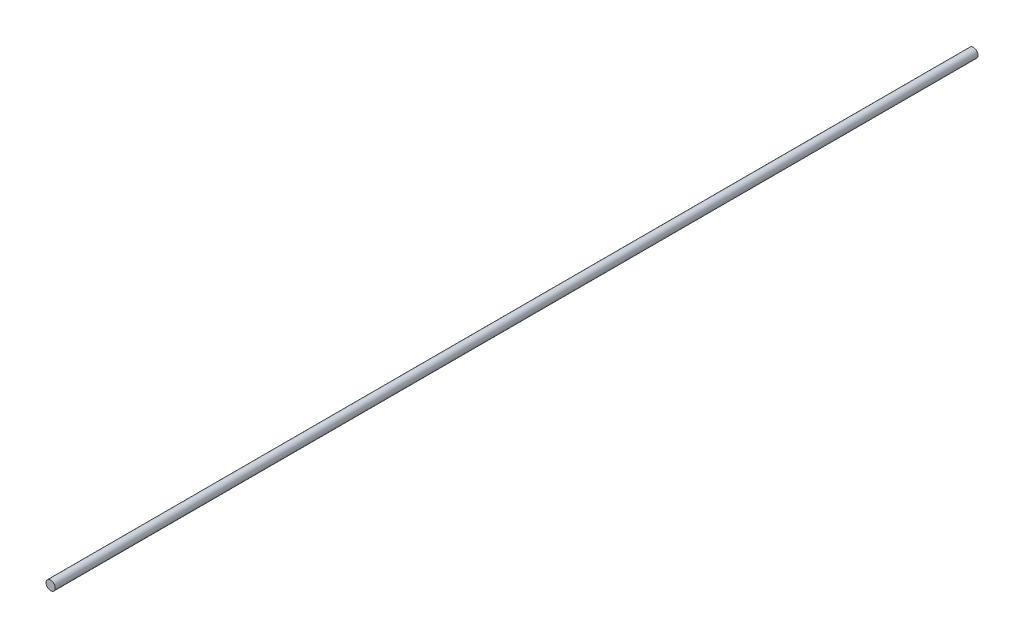
ISO-10303-21;
HEADER;
FILE_DESCRIPTION(('STEP AP214'),'2;1');
FILE_NAME('part.step','',(''),(''),'','','');
FILE_SCHEMA(('AUTOMOTIVE_DESIGN { 1 0 10303 214 1 1 1 1 }'));
ENDSEC;
DATA;
#1=APPLICATION_CONTEXT('core data for automotive mechanical design processes');
#2=APPLICATION_PROTOCOL_DEFINITION('international standard','automotive_design',2000,#1);
#3=PRODUCT_CONTEXT('',#1,'mechanical');
#4=PRODUCT('Part','Part','',(#3));
#5=PRODUCT_RELATED_PRODUCT_CATEGORY('part','',(#4));
#6=PRODUCT_DEFINITION_FORMATION('','',#4);
#7=PRODUCT_DEFINITION_CONTEXT('part definition',#1,'design');
#8=PRODUCT_DEFINITION('design','',#6,#7);
#9=PRODUCT_DEFINITION_SHAPE('','',#8);
#10=(LENGTH_UNIT() NAMED_UNIT(*) SI_UNIT(.MILLI.,.METRE.));
#11=(NAMED_UNIT(*) PLANE_ANGLE_UNIT() SI_UNIT($,.RADIAN.));
#12=(NAMED_UNIT(*) SI_UNIT($,.STERADIAN.) SOLID_ANGLE_UNIT());
#13=UNCERTAINTY_MEASURE_WITH_UNIT(LENGTH_MEASURE(1.E-05),#10,'distance_accuracy_value','');
#14=(GEOMETRIC_REPRESENTATION_CONTEXT(3) GLOBAL_UNCERTAINTY_ASSIGNED_CONTEXT((#13)) GLOBAL_UNIT_ASSIGNED_CONTEXT((#10,
#11,#12)) REPRESENTATION_CONTEXT('',''));
#15=CARTESIAN_POINT('',(0.,0.,0.));
#16=DIRECTION('',(0.,0.,1.));
#17=DIRECTION('',(1.,0.,0.));
#18=AXIS2_PLACEMENT_3D('',#15,#16,#17);
#19=CARTESIAN_POINT('',(0.,0.,1500.));
#20=DIRECTION('',(0.,0.,-1.));
#21=DIRECTION('',(-1.,0.,0.));
#22=AXIS2_PLACEMENT_3D('',#19,#20,#21);
#23=CYLINDRICAL_SURFACE('',#22,7.5);
#24=CARTESIAN_POINT('',(0.,0.,1500.));
#25=DIRECTION('',(0.,0.,1.));
#26=DIRECTION('',(1.,0.,0.));
#27=AXIS2_PLACEMENT_3D('',#24,#25,#26);
#28=CIRCLE('',#27,7.5);
#29=CARTESIAN_POINT('',(7.5,0.,1500.));
#30=VERTEX_POINT('',#29);
#31=EDGE_CURVE('E10',#30,#30,#28,.T.);
#32=ORIENTED_EDGE('',*,*,#31,.F.);
#33=EDGE_LOOP('',(#32));
#34=FACE_BOUND('',#33,.T.);
#35=CARTESIAN_POINT('',(0.,0.,0.));
#36=DIRECTION('',(0.,0.,1.));
#37=DIRECTION('',(1.,0.,0.));
#38=AXIS2_PLACEMENT_3D('',#35,#36,#37);
#39=CIRCLE('',#38,7.5);
#40=CARTESIAN_POINT('',(7.5,0.,0.));
#41=VERTEX_POINT('',#40);
#42=EDGE_CURVE('E40',#41,#41,#39,.T.);
#43=ORIENTED_EDGE('',*,*,#42,.T.);
#44=EDGE_LOOP('',(#43));
#45=FACE_BOUND('',#44,.T.);
#46=ADVANCED_FACE('F37',(#34,#45),#23,.T.);
#47=CARTESIAN_POINT('',(0.,0.,1500.));
#48=DIRECTION('',(0.,0.,1.));
#49=DIRECTION('',(1.,0.,0.));
#50=AXIS2_PLACEMENT_3D('',#47,#48,#49);
#51=PLANE('',#50);
#52=ORIENTED_EDGE('',*,*,#31,.T.);
#53=EDGE_LOOP('',(#52));
#54=FACE_BOUND('',#53,.T.);
#55=ADVANCED_FACE('F52',(#54),#51,.T.);
#56=CARTESIAN_POINT('',(0.,0.,0.));
#57=DIRECTION('',(0.,0.,1.));
#58=DIRECTION('',(1.,0.,0.));
#59=AXIS2_PLACEMENT_3D('',#56,#57,#58);
#60=PLANE('',#59);
#61=ORIENTED_EDGE('',*,*,#42,.F.);
#62=EDGE_LOOP('',(#61));
#63=FACE_BOUND('',#62,.T.);
#64=ADVANCED_FACE('F50',(#63),#60,.F.);
#65=CLOSED_SHELL('',(#46,#55,#64));
#66=MANIFOLD_SOLID_BREP('B2',#65);
#67=ADVANCED_BREP_SHAPE_REPRESENTATION('',(#18,#66),#14);
#68=SHAPE_DEFINITION_REPRESENTATION(#9,#67);
ENDSEC;
END-ISO-10303-21;
